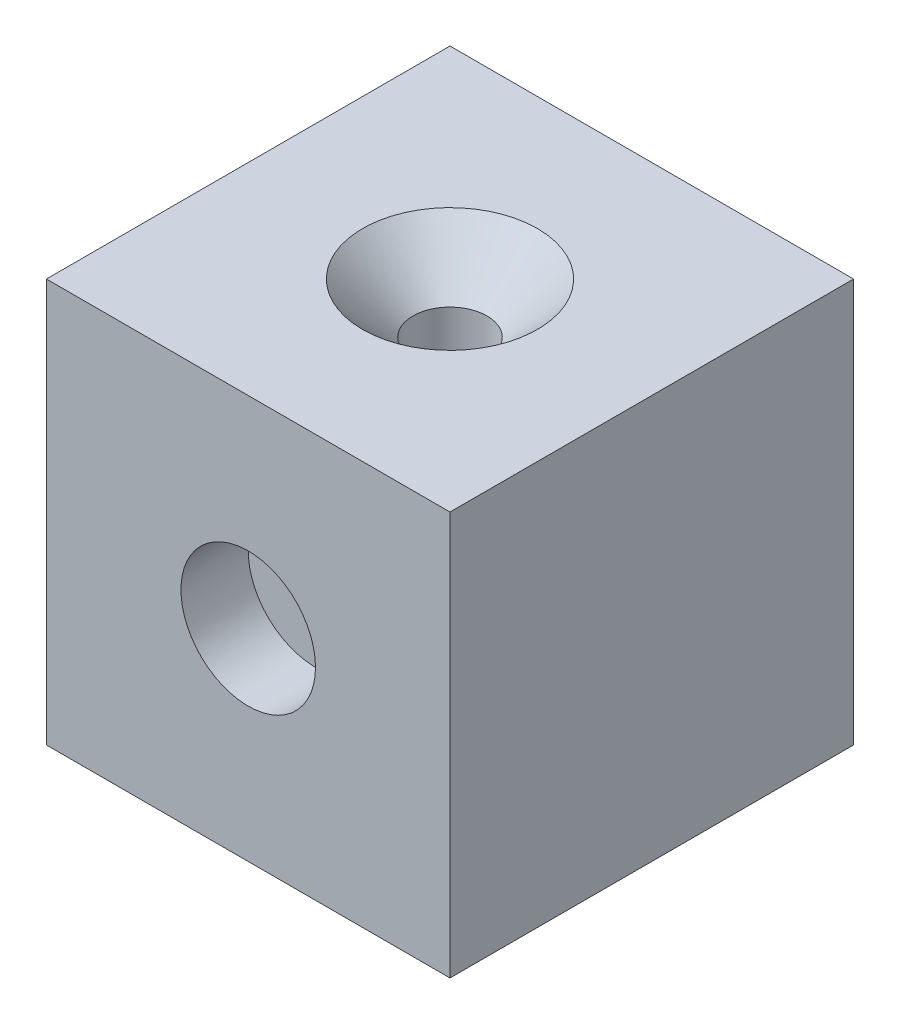
ISO-10303-21;
HEADER;
FILE_DESCRIPTION(('STEP AP214'),'2;1');
FILE_NAME('part.step','',(''),(''),'','','');
FILE_SCHEMA(('AUTOMOTIVE_DESIGN { 1 0 10303 214 1 1 1 1 }'));
ENDSEC;
DATA;
#1=APPLICATION_CONTEXT('core data for automotive mechanical design processes');
#2=APPLICATION_PROTOCOL_DEFINITION('international standard','automotive_design',2000,#1);
#3=PRODUCT_CONTEXT('',#1,'mechanical');
#4=PRODUCT('Part','Part','',(#3));
#5=PRODUCT_RELATED_PRODUCT_CATEGORY('part','',(#4));
#6=PRODUCT_DEFINITION_FORMATION('','',#4);
#7=PRODUCT_DEFINITION_CONTEXT('part definition',#1,'design');
#8=PRODUCT_DEFINITION('design','',#6,#7);
#9=PRODUCT_DEFINITION_SHAPE('','',#8);
#10=(LENGTH_UNIT() NAMED_UNIT(*) SI_UNIT(.MILLI.,.METRE.));
#11=(NAMED_UNIT(*) PLANE_ANGLE_UNIT() SI_UNIT($,.RADIAN.));
#12=(NAMED_UNIT(*) SI_UNIT($,.STERADIAN.) SOLID_ANGLE_UNIT());
#13=UNCERTAINTY_MEASURE_WITH_UNIT(LENGTH_MEASURE(1.E-05),#10,'distance_accuracy_value','');
#14=(GEOMETRIC_REPRESENTATION_CONTEXT(3) GLOBAL_UNCERTAINTY_ASSIGNED_CONTEXT((#13)) GLOBAL_UNIT_ASSIGNED_CONTEXT((#10,
#11,#12)) REPRESENTATION_CONTEXT('',''));
#15=CARTESIAN_POINT('',(0.,0.,0.));
#16=DIRECTION('',(0.,0.,1.));
#17=DIRECTION('',(1.,0.,0.));
#18=AXIS2_PLACEMENT_3D('',#15,#16,#17);
#19=CARTESIAN_POINT('',(-76.2,76.2,-76.2));
#20=DIRECTION('',(0.,0.,1.));
#21=DIRECTION('',(1.,0.,0.));
#22=AXIS2_PLACEMENT_3D('',#19,#20,#21);
#23=PLANE('',#22);
#24=DIRECTION('',(-1.,0.,0.));
#25=VECTOR('',#24,1.);
#26=CARTESIAN_POINT('',(-76.2,-76.2,-76.2));
#27=LINE('',#26,#25);
#28=CARTESIAN_POINT('',(76.2,-76.2,-76.2));
#29=VERTEX_POINT('',#28);
#30=CARTESIAN_POINT('',(-76.2,-76.2,-76.2));
#31=VERTEX_POINT('',#30);
#32=EDGE_CURVE('E79',#29,#31,#27,.T.);
#33=ORIENTED_EDGE('',*,*,#32,.T.);
#34=DIRECTION('',(0.,-1.,0.));
#35=VECTOR('',#34,1.);
#36=CARTESIAN_POINT('',(-76.2,76.2,-76.2));
#37=LINE('',#36,#35);
#38=CARTESIAN_POINT('',(-76.2,76.2,-76.2));
#39=VERTEX_POINT('',#38);
#40=EDGE_CURVE('E172',#39,#31,#37,.T.);
#41=ORIENTED_EDGE('',*,*,#40,.F.);
#42=DIRECTION('',(-1.,0.,0.));
#43=VECTOR('',#42,1.);
#44=CARTESIAN_POINT('',(-76.2,76.2,-76.2));
#45=LINE('',#44,#43);
#46=CARTESIAN_POINT('',(76.2,76.2,-76.2));
#47=VERTEX_POINT('',#46);
#48=EDGE_CURVE('E58',#47,#39,#45,.T.);
#49=ORIENTED_EDGE('',*,*,#48,.F.);
#50=DIRECTION('',(0.,-1.,0.));
#51=VECTOR('',#50,1.);
#52=CARTESIAN_POINT('',(76.2,76.2,-76.2));
#53=LINE('',#52,#51);
#54=EDGE_CURVE('E181',#47,#29,#53,.T.);
#55=ORIENTED_EDGE('',*,*,#54,.T.);
#56=EDGE_LOOP('',(#33,#41,#49,#55));
#57=FACE_BOUND('',#56,.T.);
#58=CARTESIAN_POINT('',(0.,0.,-76.2));
#59=DIRECTION('',(0.,0.,1.));
#60=DIRECTION('',(1.,0.,0.));
#61=AXIS2_PLACEMENT_3D('',#58,#59,#60);
#62=CIRCLE('',#61,25.4);
#63=CARTESIAN_POINT('',(25.4,0.,-76.2));
#64=VERTEX_POINT('',#63);
#65=EDGE_CURVE('E11',#64,#64,#62,.F.);
#66=ORIENTED_EDGE('',*,*,#65,.F.);
#67=EDGE_LOOP('',(#66));
#68=FACE_BOUND('',#67,.T.);
#69=ADVANCED_FACE('F34',(#57,#68),#23,.F.);
#70=CARTESIAN_POINT('',(-76.2,76.2,-76.2));
#71=DIRECTION('',(1.,0.,0.));
#72=DIRECTION('',(0.,0.,-1.));
#73=AXIS2_PLACEMENT_3D('',#70,#71,#72);
#74=PLANE('',#73);
#75=DIRECTION('',(0.,0.,1.));
#76=VECTOR('',#75,1.);
#77=CARTESIAN_POINT('',(-76.2,-63.5,-63.5));
#78=LINE('',#77,#76);
#79=CARTESIAN_POINT('',(-76.2,-63.5,-63.5));
#80=VERTEX_POINT('',#79);
#81=CARTESIAN_POINT('',(-76.2,-63.5,63.5));
#82=VERTEX_POINT('',#81);
#83=EDGE_CURVE('E138',#80,#82,#78,.T.);
#84=ORIENTED_EDGE('',*,*,#83,.F.);
#85=DIRECTION('',(0.,-1.,0.));
#86=VECTOR('',#85,1.);
#87=CARTESIAN_POINT('',(-76.2,63.5,-63.5));
#88=LINE('',#87,#86);
#89=CARTESIAN_POINT('',(-76.2,63.5,-63.5));
#90=VERTEX_POINT('',#89);
#91=EDGE_CURVE('E49',#90,#80,#88,.T.);
#92=ORIENTED_EDGE('',*,*,#91,.F.);
#93=DIRECTION('',(0.,0.,-1.));
#94=VECTOR('',#93,1.);
#95=CARTESIAN_POINT('',(-76.2,63.5,-63.5));
#96=LINE('',#95,#94);
#97=CARTESIAN_POINT('',(-76.2,63.5,63.5));
#98=VERTEX_POINT('',#97);
#99=EDGE_CURVE('E129',#98,#90,#96,.T.);
#100=ORIENTED_EDGE('',*,*,#99,.F.);
#101=DIRECTION('',(0.,1.,0.));
#102=VECTOR('',#101,1.);
#103=CARTESIAN_POINT('',(-76.2,63.5,63.5));
#104=LINE('',#103,#102);
#105=EDGE_CURVE('E132',#82,#98,#104,.T.);
#106=ORIENTED_EDGE('',*,*,#105,.F.);
#107=EDGE_LOOP('',(#84,#92,#100,#106));
#108=FACE_BOUND('',#107,.T.);
#109=DIRECTION('',(0.,0.,1.));
#110=VECTOR('',#109,1.);
#111=CARTESIAN_POINT('',(-76.2,-76.2,-76.2));
#112=LINE('',#111,#110);
#113=CARTESIAN_POINT('',(-76.2,-76.2,76.2));
#114=VERTEX_POINT('',#113);
#115=EDGE_CURVE('E165',#31,#114,#112,.T.);
#116=ORIENTED_EDGE('',*,*,#115,.T.);
#117=DIRECTION('',(0.,-1.,0.));
#118=VECTOR('',#117,1.);
#119=CARTESIAN_POINT('',(-76.2,76.2,76.2));
#120=LINE('',#119,#118);
#121=CARTESIAN_POINT('',(-76.2,76.2,76.2));
#122=VERTEX_POINT('',#121);
#123=EDGE_CURVE('E42',#122,#114,#120,.T.);
#124=ORIENTED_EDGE('',*,*,#123,.F.);
#125=DIRECTION('',(0.,0.,1.));
#126=VECTOR('',#125,1.);
#127=CARTESIAN_POINT('',(-76.2,76.2,-76.2));
#128=LINE('',#127,#126);
#129=EDGE_CURVE('E166',#39,#122,#128,.T.);
#130=ORIENTED_EDGE('',*,*,#129,.F.);
#131=ORIENTED_EDGE('',*,*,#40,.T.);
#132=EDGE_LOOP('',(#116,#124,#130,#131));
#133=FACE_BOUND('',#132,.T.);
#134=ADVANCED_FACE('F36',(#108,#133),#74,.F.);
#135=CARTESIAN_POINT('',(-76.2,76.2,76.2));
#136=DIRECTION('',(0.,0.,-1.));
#137=DIRECTION('',(-1.,0.,0.));
#138=AXIS2_PLACEMENT_3D('',#135,#136,#137);
#139=PLANE('',#138);
#140=CARTESIAN_POINT('',(0.,0.,76.2));
#141=DIRECTION('',(0.,0.,1.));
#142=DIRECTION('',(1.,0.,0.));
#143=AXIS2_PLACEMENT_3D('',#140,#141,#142);
#144=CIRCLE('',#143,25.4);
#145=CARTESIAN_POINT('',(25.4,0.,76.2));
#146=VERTEX_POINT('',#145);
#147=EDGE_CURVE('E150',#146,#146,#144,.T.);
#148=ORIENTED_EDGE('',*,*,#147,.F.);
#149=EDGE_LOOP('',(#148));
#150=FACE_BOUND('',#149,.T.);
#151=DIRECTION('',(1.,0.,0.));
#152=VECTOR('',#151,1.);
#153=CARTESIAN_POINT('',(-76.2,-76.2,76.2));
#154=LINE('',#153,#152);
#155=CARTESIAN_POINT('',(76.2,-76.2,76.2));
#156=VERTEX_POINT('',#155);
#157=EDGE_CURVE('E175',#114,#156,#154,.T.);
#158=ORIENTED_EDGE('',*,*,#157,.T.);
#159=DIRECTION('',(0.,-1.,0.));
#160=VECTOR('',#159,1.);
#161=CARTESIAN_POINT('',(76.2,76.2,76.2));
#162=LINE('',#161,#160);
#163=CARTESIAN_POINT('',(76.2,76.2,76.2));
#164=VERTEX_POINT('',#163);
#165=EDGE_CURVE('E183',#164,#156,#162,.T.);
#166=ORIENTED_EDGE('',*,*,#165,.F.);
#167=DIRECTION('',(1.,0.,0.));
#168=VECTOR('',#167,1.);
#169=CARTESIAN_POINT('',(-76.2,76.2,76.2));
#170=LINE('',#169,#168);
#171=EDGE_CURVE('E87',#122,#164,#170,.T.);
#172=ORIENTED_EDGE('',*,*,#171,.F.);
#173=ORIENTED_EDGE('',*,*,#123,.T.);
#174=EDGE_LOOP('',(#158,#166,#172,#173));
#175=FACE_BOUND('',#174,.T.);
#176=ADVANCED_FACE('F186',(#150,#175),#139,.F.);
#177=CARTESIAN_POINT('',(76.2,76.2,-76.2));
#178=DIRECTION('',(-1.,0.,0.));
#179=DIRECTION('',(0.,0.,1.));
#180=AXIS2_PLACEMENT_3D('',#177,#178,#179);
#181=PLANE('',#180);
#182=DIRECTION('',(0.,0.,-1.));
#183=VECTOR('',#182,1.);
#184=CARTESIAN_POINT('',(76.2,-76.2,-76.2));
#185=LINE('',#184,#183);
#186=EDGE_CURVE('E177',#156,#29,#185,.T.);
#187=ORIENTED_EDGE('',*,*,#186,.T.);
#188=ORIENTED_EDGE('',*,*,#54,.F.);
#189=DIRECTION('',(0.,0.,-1.));
#190=VECTOR('',#189,1.);
#191=CARTESIAN_POINT('',(76.2,76.2,-76.2));
#192=LINE('',#191,#190);
#193=EDGE_CURVE('E169',#164,#47,#192,.T.);
#194=ORIENTED_EDGE('',*,*,#193,.F.);
#195=ORIENTED_EDGE('',*,*,#165,.T.);
#196=EDGE_LOOP('',(#187,#188,#194,#195));
#197=FACE_BOUND('',#196,.T.);
#198=ADVANCED_FACE('F195',(#197),#181,.F.);
#199=CARTESIAN_POINT('',(0.,76.2,0.));
#200=DIRECTION('',(0.,1.,0.));
#201=DIRECTION('',(0.,0.,1.));
#202=AXIS2_PLACEMENT_3D('',#199,#200,#201);
#203=PLANE('',#202);
#204=CARTESIAN_POINT('',(0.,76.2,0.));
#205=DIRECTION('',(0.,-1.,0.));
#206=DIRECTION('',(0.,0.,-1.));
#207=AXIS2_PLACEMENT_3D('',#204,#205,#206);
#208=CIRCLE('',#207,33.0200000000002);
#209=CARTESIAN_POINT('',(0.,76.2,-33.0200000000002));
#210=VERTEX_POINT('',#209);
#211=EDGE_CURVE('E154',#210,#210,#208,.T.);
#212=ORIENTED_EDGE('',*,*,#211,.T.);
#213=EDGE_LOOP('',(#212));
#214=FACE_BOUND('',#213,.T.);
#215=ORIENTED_EDGE('',*,*,#129,.T.);
#216=ORIENTED_EDGE('',*,*,#171,.T.);
#217=ORIENTED_EDGE('',*,*,#193,.T.);
#218=ORIENTED_EDGE('',*,*,#48,.T.);
#219=EDGE_LOOP('',(#215,#216,#217,#218));
#220=FACE_BOUND('',#219,.T.);
#221=ADVANCED_FACE('F198',(#214,#220),#203,.T.);
#222=CARTESIAN_POINT('',(0.,-76.2,0.));
#223=DIRECTION('',(0.,1.,0.));
#224=DIRECTION('',(0.,0.,1.));
#225=AXIS2_PLACEMENT_3D('',#222,#223,#224);
#226=PLANE('',#225);
#227=ORIENTED_EDGE('',*,*,#115,.F.);
#228=ORIENTED_EDGE('',*,*,#32,.F.);
#229=ORIENTED_EDGE('',*,*,#186,.F.);
#230=ORIENTED_EDGE('',*,*,#157,.F.);
#231=EDGE_LOOP('',(#227,#228,#229,#230));
#232=FACE_BOUND('',#231,.T.);
#233=ADVANCED_FACE('F191',(#232),#226,.F.);
#234=CARTESIAN_POINT('',(0.,12.7,0.));
#235=DIRECTION('',(0.,-1.,0.));
#236=DIRECTION('',(0.,0.,-1.));
#237=AXIS2_PLACEMENT_3D('',#234,#235,#236);
#238=PLANE('',#237);
#239=CARTESIAN_POINT('',(0.,12.7,0.));
#240=DIRECTION('',(0.,-1.,0.));
#241=DIRECTION('',(0.,0.,-1.));
#242=AXIS2_PLACEMENT_3D('',#239,#240,#241);
#243=CIRCLE('',#242,13.97);
#244=CARTESIAN_POINT('',(0.,12.7,-13.97));
#245=VERTEX_POINT('',#244);
#246=EDGE_CURVE('E162',#245,#245,#243,.T.);
#247=ORIENTED_EDGE('',*,*,#246,.F.);
#248=EDGE_LOOP('',(#247));
#249=FACE_BOUND('',#248,.T.);
#250=ADVANCED_FACE('F206',(#249),#238,.F.);
#251=CARTESIAN_POINT('',(0.,0.,0.));
#252=DIRECTION('',(0.,-1.,0.));
#253=DIRECTION('',(0.,0.,-1.));
#254=AXIS2_PLACEMENT_3D('',#251,#252,#253);
#255=CYLINDRICAL_SURFACE('',#254,13.97);
#256=CARTESIAN_POINT('',(0.,57.15,0.));
#257=DIRECTION('',(0.,-1.,0.));
#258=DIRECTION('',(0.,0.,-1.));
#259=AXIS2_PLACEMENT_3D('',#256,#257,#258);
#260=CIRCLE('',#259,13.97);
#261=CARTESIAN_POINT('',(0.,57.15,-13.97));
#262=VERTEX_POINT('',#261);
#263=EDGE_CURVE('E159',#262,#262,#260,.T.);
#264=ORIENTED_EDGE('',*,*,#263,.F.);
#265=EDGE_LOOP('',(#264));
#266=FACE_BOUND('',#265,.T.);
#267=ORIENTED_EDGE('',*,*,#246,.T.);
#268=EDGE_LOOP('',(#267));
#269=FACE_BOUND('',#268,.T.);
#270=ADVANCED_FACE('F235',(#266,#269),#255,.F.);
#271=CARTESIAN_POINT('',(0.,57.15,0.));
#272=DIRECTION('',(0.,1.,0.));
#273=DIRECTION('',(0.,0.,1.));
#274=AXIS2_PLACEMENT_3D('',#271,#272,#273);
#275=CONICAL_SURFACE('',#274,13.97,0.785398163397453);
#276=ORIENTED_EDGE('',*,*,#211,.F.);
#277=EDGE_LOOP('',(#276));
#278=FACE_BOUND('',#277,.T.);
#279=ORIENTED_EDGE('',*,*,#263,.T.);
#280=EDGE_LOOP('',(#279));
#281=FACE_BOUND('',#280,.T.);
#282=ADVANCED_FACE('F225',(#278,#281),#275,.F.);
#283=CARTESIAN_POINT('',(0.,0.,50.8));
#284=DIRECTION('',(0.,0.,1.));
#285=DIRECTION('',(1.,0.,0.));
#286=AXIS2_PLACEMENT_3D('',#283,#284,#285);
#287=CYLINDRICAL_SURFACE('',#286,25.4);
#288=CARTESIAN_POINT('',(0.,0.,50.8));
#289=DIRECTION('',(0.,0.,1.));
#290=DIRECTION('',(1.,0.,0.));
#291=AXIS2_PLACEMENT_3D('',#288,#289,#290);
#292=CIRCLE('',#291,25.4);
#293=CARTESIAN_POINT('',(25.4,0.,50.8));
#294=VERTEX_POINT('',#293);
#295=EDGE_CURVE('E151',#294,#294,#292,.T.);
#296=ORIENTED_EDGE('',*,*,#295,.F.);
#297=EDGE_LOOP('',(#296));
#298=FACE_BOUND('',#297,.T.);
#299=ORIENTED_EDGE('',*,*,#147,.T.);
#300=EDGE_LOOP('',(#299));
#301=FACE_BOUND('',#300,.T.);
#302=ADVANCED_FACE('F222',(#298,#301),#287,.F.);
#303=CARTESIAN_POINT('',(0.,0.,50.8));
#304=DIRECTION('',(0.,0.,1.));
#305=DIRECTION('',(1.,0.,0.));
#306=AXIS2_PLACEMENT_3D('',#303,#304,#305);
#307=PLANE('',#306);
#308=ORIENTED_EDGE('',*,*,#295,.T.);
#309=EDGE_LOOP('',(#308));
#310=FACE_BOUND('',#309,.T.);
#311=ADVANCED_FACE('F224',(#310),#307,.T.);
#312=CARTESIAN_POINT('',(0.,0.,-101.6));
#313=DIRECTION('',(0.,0.,1.));
#314=DIRECTION('',(1.,0.,0.));
#315=AXIS2_PLACEMENT_3D('',#312,#313,#314);
#316=CYLINDRICAL_SURFACE('',#315,25.4);
#317=CARTESIAN_POINT('',(0.,0.,-101.6));
#318=DIRECTION('',(0.,0.,-1.));
#319=DIRECTION('',(-1.,0.,0.));
#320=AXIS2_PLACEMENT_3D('',#317,#318,#319);
#321=CIRCLE('',#320,25.4);
#322=CARTESIAN_POINT('',(-25.4,0.,-101.6));
#323=VERTEX_POINT('',#322);
#324=EDGE_CURVE('E144',#323,#323,#321,.T.);
#325=ORIENTED_EDGE('',*,*,#324,.F.);
#326=EDGE_LOOP('',(#325));
#327=FACE_BOUND('',#326,.T.);
#328=ORIENTED_EDGE('',*,*,#65,.T.);
#329=EDGE_LOOP('',(#328));
#330=FACE_BOUND('',#329,.T.);
#331=ADVANCED_FACE('F232',(#327,#330),#316,.T.);
#332=CARTESIAN_POINT('',(0.,0.,-101.6));
#333=DIRECTION('',(0.,0.,-1.));
#334=DIRECTION('',(-1.,0.,0.));
#335=AXIS2_PLACEMENT_3D('',#332,#333,#334);
#336=PLANE('',#335);
#337=ORIENTED_EDGE('',*,*,#324,.T.);
#338=EDGE_LOOP('',(#337));
#339=FACE_BOUND('',#338,.T.);
#340=ADVANCED_FACE('F288',(#339),#336,.T.);
#341=CARTESIAN_POINT('',(-63.5,63.5,-63.5));
#342=DIRECTION('',(0.,0.,-1.));
#343=DIRECTION('',(-1.,0.,0.));
#344=AXIS2_PLACEMENT_3D('',#341,#342,#343);
#345=PLANE('',#344);
#346=ORIENTED_EDGE('',*,*,#91,.T.);
#347=DIRECTION('',(-1.,0.,0.));
#348=VECTOR('',#347,1.);
#349=CARTESIAN_POINT('',(-63.5,-63.5,-63.5));
#350=LINE('',#349,#348);
#351=CARTESIAN_POINT('',(-63.5,-63.5,-63.5));
#352=VERTEX_POINT('',#351);
#353=EDGE_CURVE('E107',#352,#80,#350,.T.);
#354=ORIENTED_EDGE('',*,*,#353,.F.);
#355=DIRECTION('',(0.,-1.,0.));
#356=VECTOR('',#355,1.);
#357=CARTESIAN_POINT('',(-63.5,63.5,-63.5));
#358=LINE('',#357,#356);
#359=CARTESIAN_POINT('',(-63.5,63.5,-63.5));
#360=VERTEX_POINT('',#359);
#361=EDGE_CURVE('E111',#360,#352,#358,.T.);
#362=ORIENTED_EDGE('',*,*,#361,.F.);
#363=DIRECTION('',(-1.,0.,0.));
#364=VECTOR('',#363,1.);
#365=CARTESIAN_POINT('',(-63.5,63.5,-63.5));
#366=LINE('',#365,#364);
#367=EDGE_CURVE('E142',#360,#90,#366,.T.);
#368=ORIENTED_EDGE('',*,*,#367,.T.);
#369=EDGE_LOOP('',(#346,#354,#362,#368));
#370=FACE_BOUND('',#369,.T.);
#371=ADVANCED_FACE('F109',(#370),#345,.F.);
#372=CARTESIAN_POINT('',(-63.5,63.5,-63.5));
#373=DIRECTION('',(0.,1.,0.));
#374=DIRECTION('',(0.,0.,1.));
#375=AXIS2_PLACEMENT_3D('',#372,#373,#374);
#376=PLANE('',#375);
#377=ORIENTED_EDGE('',*,*,#99,.T.);
#378=ORIENTED_EDGE('',*,*,#367,.F.);
#379=DIRECTION('',(0.,0.,-1.));
#380=VECTOR('',#379,1.);
#381=CARTESIAN_POINT('',(-63.5,63.5,-63.5));
#382=LINE('',#381,#380);
#383=CARTESIAN_POINT('',(-63.5,63.5,63.5));
#384=VERTEX_POINT('',#383);
#385=EDGE_CURVE('E117',#384,#360,#382,.T.);
#386=ORIENTED_EDGE('',*,*,#385,.F.);
#387=DIRECTION('',(-1.,0.,0.));
#388=VECTOR('',#387,1.);
#389=CARTESIAN_POINT('',(-63.5,63.5,63.5));
#390=LINE('',#389,#388);
#391=EDGE_CURVE('E145',#384,#98,#390,.T.);
#392=ORIENTED_EDGE('',*,*,#391,.T.);
#393=EDGE_LOOP('',(#377,#378,#386,#392));
#394=FACE_BOUND('',#393,.T.);
#395=ADVANCED_FACE('F311',(#394),#376,.F.);
#396=CARTESIAN_POINT('',(-63.5,63.5,63.5));
#397=DIRECTION('',(0.,0.,1.));
#398=DIRECTION('',(1.,0.,0.));
#399=AXIS2_PLACEMENT_3D('',#396,#397,#398);
#400=PLANE('',#399);
#401=ORIENTED_EDGE('',*,*,#105,.T.);
#402=ORIENTED_EDGE('',*,*,#391,.F.);
#403=DIRECTION('',(0.,1.,0.));
#404=VECTOR('',#403,1.);
#405=CARTESIAN_POINT('',(-63.5,63.5,63.5));
#406=LINE('',#405,#404);
#407=CARTESIAN_POINT('',(-63.5,-63.5,63.5));
#408=VERTEX_POINT('',#407);
#409=EDGE_CURVE('E125',#408,#384,#406,.T.);
#410=ORIENTED_EDGE('',*,*,#409,.F.);
#411=DIRECTION('',(-1.,0.,0.));
#412=VECTOR('',#411,1.);
#413=CARTESIAN_POINT('',(-63.5,-63.5,63.5));
#414=LINE('',#413,#412);
#415=EDGE_CURVE('E116',#408,#82,#414,.T.);
#416=ORIENTED_EDGE('',*,*,#415,.T.);
#417=EDGE_LOOP('',(#401,#402,#410,#416));
#418=FACE_BOUND('',#417,.T.);
#419=ADVANCED_FACE('F320',(#418),#400,.F.);
#420=CARTESIAN_POINT('',(-63.5,-63.5,-63.5));
#421=DIRECTION('',(0.,-1.,0.));
#422=DIRECTION('',(0.,0.,-1.));
#423=AXIS2_PLACEMENT_3D('',#420,#421,#422);
#424=PLANE('',#423);
#425=ORIENTED_EDGE('',*,*,#83,.T.);
#426=ORIENTED_EDGE('',*,*,#415,.F.);
#427=DIRECTION('',(0.,0.,1.));
#428=VECTOR('',#427,1.);
#429=CARTESIAN_POINT('',(-63.5,-63.5,-63.5));
#430=LINE('',#429,#428);
#431=EDGE_CURVE('E120',#352,#408,#430,.T.);
#432=ORIENTED_EDGE('',*,*,#431,.F.);
#433=ORIENTED_EDGE('',*,*,#353,.T.);
#434=EDGE_LOOP('',(#425,#426,#432,#433));
#435=FACE_BOUND('',#434,.T.);
#436=ADVANCED_FACE('F121',(#435),#424,.F.);
#437=CARTESIAN_POINT('',(-63.5,0.,0.));
#438=DIRECTION('',(-1.,0.,0.));
#439=DIRECTION('',(0.,0.,1.));
#440=AXIS2_PLACEMENT_3D('',#437,#438,#439);
#441=PLANE('',#440);
#442=ORIENTED_EDGE('',*,*,#361,.T.);
#443=ORIENTED_EDGE('',*,*,#431,.T.);
#444=ORIENTED_EDGE('',*,*,#409,.T.);
#445=ORIENTED_EDGE('',*,*,#385,.T.);
#446=EDGE_LOOP('',(#442,#443,#444,#445));
#447=FACE_BOUND('',#446,.T.);
#448=ADVANCED_FACE('F127',(#447),#441,.T.);
#449=CLOSED_SHELL('',(#69,#134,#176,#198,#221,#233,#250,#270,#282,#302,#311,#331,#340,#371,#395,
#419,#436,#448));
#450=MANIFOLD_SOLID_BREP('B2',#449);
#451=ADVANCED_BREP_SHAPE_REPRESENTATION('',(#18,#450),#14);
#452=SHAPE_DEFINITION_REPRESENTATION(#9,#451);
ENDSEC;
END-ISO-10303-21;
